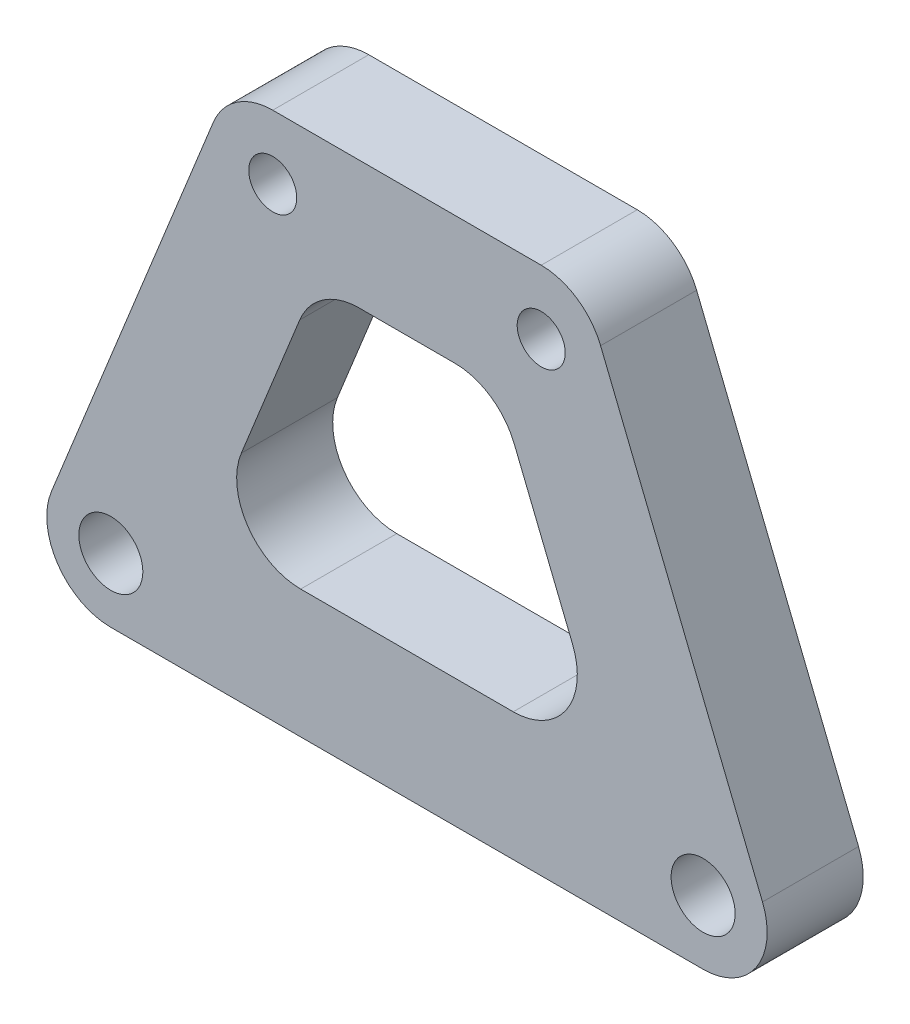
ISO-10303-21;
HEADER;
FILE_DESCRIPTION(('STEP AP214'),'2;1');
FILE_NAME('part.step','',(''),(''),'','','');
FILE_SCHEMA(('AUTOMOTIVE_DESIGN { 1 0 10303 214 1 1 1 1 }'));
ENDSEC;
DATA;
#1=APPLICATION_CONTEXT('core data for automotive mechanical design processes');
#2=APPLICATION_PROTOCOL_DEFINITION('international standard','automotive_design',2000,#1);
#3=PRODUCT_CONTEXT('',#1,'mechanical');
#4=PRODUCT('Part','Part','',(#3));
#5=PRODUCT_RELATED_PRODUCT_CATEGORY('part','',(#4));
#6=PRODUCT_DEFINITION_FORMATION('','',#4);
#7=PRODUCT_DEFINITION_CONTEXT('part definition',#1,'design');
#8=PRODUCT_DEFINITION('design','',#6,#7);
#9=PRODUCT_DEFINITION_SHAPE('','',#8);
#10=(LENGTH_UNIT() NAMED_UNIT(*) SI_UNIT(.MILLI.,.METRE.));
#11=(NAMED_UNIT(*) PLANE_ANGLE_UNIT() SI_UNIT($,.RADIAN.));
#12=(NAMED_UNIT(*) SI_UNIT($,.STERADIAN.) SOLID_ANGLE_UNIT());
#13=UNCERTAINTY_MEASURE_WITH_UNIT(LENGTH_MEASURE(1.E-05),#10,'distance_accuracy_value','');
#14=(GEOMETRIC_REPRESENTATION_CONTEXT(3) GLOBAL_UNCERTAINTY_ASSIGNED_CONTEXT((#13)) GLOBAL_UNIT_ASSIGNED_CONTEXT((#10,
#11,#12)) REPRESENTATION_CONTEXT('',''));
#15=CARTESIAN_POINT('',(0.,0.,0.));
#16=DIRECTION('',(0.,0.,1.));
#17=DIRECTION('',(1.,0.,0.));
#18=AXIS2_PLACEMENT_3D('',#15,#16,#17);
#19=CARTESIAN_POINT('',(0.,4.,6.));
#20=DIRECTION('',(0.,1.,0.));
#21=DIRECTION('',(0.,0.,1.));
#22=AXIS2_PLACEMENT_3D('',#19,#20,#21);
#23=PLANE('',#22);
#24=DIRECTION('',(1.,0.,0.));
#25=VECTOR('',#24,1.);
#26=CARTESIAN_POINT('',(0.,4.,0.));
#27=LINE('',#26,#25);
#28=CARTESIAN_POINT('',(11.8604877481019,4.,0.));
#29=VERTEX_POINT('',#28);
#30=CARTESIAN_POINT('',(25.1395122518981,4.,0.));
#31=VERTEX_POINT('',#30);
#32=EDGE_CURVE('E184',#29,#31,#27,.T.);
#33=ORIENTED_EDGE('',*,*,#32,.F.);
#34=DIRECTION('',(0.,0.,-1.));
#35=VECTOR('',#34,1.);
#36=CARTESIAN_POINT('',(11.8604877481019,4.,6.));
#37=LINE('',#36,#35);
#38=CARTESIAN_POINT('',(11.8604877481019,4.,6.));
#39=VERTEX_POINT('',#38);
#40=EDGE_CURVE('E162',#29,#39,#37,.F.);
#41=ORIENTED_EDGE('',*,*,#40,.T.);
#42=DIRECTION('',(1.,0.,0.));
#43=VECTOR('',#42,1.);
#44=CARTESIAN_POINT('',(0.,4.,6.));
#45=LINE('',#44,#43);
#46=CARTESIAN_POINT('',(25.1395122518981,4.,6.));
#47=VERTEX_POINT('',#46);
#48=EDGE_CURVE('E277',#39,#47,#45,.T.);
#49=ORIENTED_EDGE('',*,*,#48,.T.);
#50=DIRECTION('',(0.,0.,-1.));
#51=VECTOR('',#50,1.);
#52=CARTESIAN_POINT('',(25.1395122518981,4.,6.));
#53=LINE('',#52,#51);
#54=EDGE_CURVE('E178',#47,#31,#53,.T.);
#55=ORIENTED_EDGE('',*,*,#54,.T.);
#56=EDGE_LOOP('',(#33,#41,#49,#55));
#57=FACE_BOUND('',#56,.T.);
#58=ADVANCED_FACE('F43',(#57),#23,.T.);
#59=CARTESIAN_POINT('',(3.70873541826715,-1.49842637366364,6.));
#60=DIRECTION('',(-0.927183854566789,0.37460659341591,0.));
#61=DIRECTION('',(-0.37460659341591,-0.927183854566789,0.));
#62=AXIS2_PLACEMENT_3D('',#59,#60,#61);
#63=PLANE('',#62);
#64=DIRECTION('',(0.37460659341591,0.927183854566788,0.));
#65=VECTOR('',#64,1.);
#66=CARTESIAN_POINT('',(3.70873541826715,-1.49842637366364,6.));
#67=LINE('',#66,#65);
#68=CARTESIAN_POINT('',(8.15175232983473,9.49842637366364,6.));
#69=VERTEX_POINT('',#68);
#70=CARTESIAN_POINT('',(11.8017107387018,18.5323904469669,6.));
#71=VERTEX_POINT('',#70);
#72=EDGE_CURVE('E177',#69,#71,#67,.T.);
#73=ORIENTED_EDGE('',*,*,#72,.F.);
#74=DIRECTION('',(0.,0.,-1.));
#75=VECTOR('',#74,1.);
#76=CARTESIAN_POINT('',(8.15175232983473,9.49842637366364,6.));
#77=LINE('',#76,#75);
#78=CARTESIAN_POINT('',(8.15175232983473,9.49842637366364,0.));
#79=VERTEX_POINT('',#78);
#80=EDGE_CURVE('E161',#69,#79,#77,.T.);
#81=ORIENTED_EDGE('',*,*,#80,.T.);
#82=DIRECTION('',(0.37460659341591,0.927183854566788,0.));
#83=VECTOR('',#82,1.);
#84=CARTESIAN_POINT('',(3.70873541826715,-1.49842637366364,0.));
#85=LINE('',#84,#83);
#86=CARTESIAN_POINT('',(11.8017107387018,18.5323904469669,0.));
#87=VERTEX_POINT('',#86);
#88=EDGE_CURVE('E174',#79,#87,#85,.T.);
#89=ORIENTED_EDGE('',*,*,#88,.T.);
#90=DIRECTION('',(0.,0.,-1.));
#91=VECTOR('',#90,1.);
#92=CARTESIAN_POINT('',(11.8017107387018,18.5323904469669,6.));
#93=LINE('',#92,#91);
#94=EDGE_CURVE('E179',#87,#71,#93,.F.);
#95=ORIENTED_EDGE('',*,*,#94,.T.);
#96=EDGE_LOOP('',(#73,#81,#89,#95));
#97=FACE_BOUND('',#96,.T.);
#98=ADVANCED_FACE('F173',(#97),#63,.F.);
#99=CARTESIAN_POINT('',(0.,21.0339640733033,6.));
#100=DIRECTION('',(0.,1.,0.));
#101=DIRECTION('',(0.,0.,1.));
#102=AXIS2_PLACEMENT_3D('',#99,#100,#101);
#103=PLANE('',#102);
#104=DIRECTION('',(1.,0.,0.));
#105=VECTOR('',#104,1.);
#106=CARTESIAN_POINT('',(0.,21.0339640733033,0.));
#107=LINE('',#106,#105);
#108=CARTESIAN_POINT('',(15.510446156969,21.0339640733033,0.));
#109=VERTEX_POINT('',#108);
#110=CARTESIAN_POINT('',(21.489553843031,21.0339640733033,0.));
#111=VERTEX_POINT('',#110);
#112=EDGE_CURVE('E183',#109,#111,#107,.T.);
#113=ORIENTED_EDGE('',*,*,#112,.T.);
#114=DIRECTION('',(0.,0.,-1.));
#115=VECTOR('',#114,1.);
#116=CARTESIAN_POINT('',(21.489553843031,21.0339640733033,6.));
#117=LINE('',#116,#115);
#118=CARTESIAN_POINT('',(21.489553843031,21.0339640733033,6.));
#119=VERTEX_POINT('',#118);
#120=EDGE_CURVE('E209',#111,#119,#117,.F.);
#121=ORIENTED_EDGE('',*,*,#120,.T.);
#122=DIRECTION('',(1.,0.,0.));
#123=VECTOR('',#122,1.);
#124=CARTESIAN_POINT('',(0.,21.0339640733033,6.));
#125=LINE('',#124,#123);
#126=CARTESIAN_POINT('',(15.510446156969,21.0339640733033,6.));
#127=VERTEX_POINT('',#126);
#128=EDGE_CURVE('E261',#127,#119,#125,.T.);
#129=ORIENTED_EDGE('',*,*,#128,.F.);
#130=DIRECTION('',(0.,0.,-1.));
#131=VECTOR('',#130,1.);
#132=CARTESIAN_POINT('',(15.510446156969,21.0339640733033,0.));
#133=LINE('',#132,#131);
#134=EDGE_CURVE('E206',#127,#109,#133,.T.);
#135=ORIENTED_EDGE('',*,*,#134,.T.);
#136=EDGE_LOOP('',(#113,#121,#129,#135));
#137=FACE_BOUND('',#136,.T.);
#138=ADVANCED_FACE('F272',(#137),#103,.F.);
#139=CARTESIAN_POINT('',(-3.70873541826715,1.49842637366364,6.));
#140=DIRECTION('',(-0.927183854566788,0.374606593415909,0.));
#141=DIRECTION('',(-0.374606593415909,-0.927183854566789,0.));
#142=AXIS2_PLACEMENT_3D('',#139,#140,#141);
#143=PLANE('',#142);
#144=DIRECTION('',(0.374606593415909,0.927183854566789,0.));
#145=VECTOR('',#144,1.);
#146=CARTESIAN_POINT('',(-3.70873541826715,1.49842637366364,0.));
#147=LINE('',#146,#145);
#148=CARTESIAN_POINT('',(-3.70873541826715,1.49842637366364,0.));
#149=VERTEX_POINT('',#148);
#150=CARTESIAN_POINT('',(6.4056426039624,26.5323904469669,0.));
#151=VERTEX_POINT('',#150);
#152=EDGE_CURVE('E285',#149,#151,#147,.T.);
#153=ORIENTED_EDGE('',*,*,#152,.F.);
#154=DIRECTION('',(0.,0.,-1.));
#155=VECTOR('',#154,1.);
#156=CARTESIAN_POINT('',(-3.70873541826715,1.49842637366364,6.));
#157=LINE('',#156,#155);
#158=CARTESIAN_POINT('',(-3.70873541826715,1.49842637366364,6.));
#159=VERTEX_POINT('',#158);
#160=EDGE_CURVE('E227',#149,#159,#157,.F.);
#161=ORIENTED_EDGE('',*,*,#160,.T.);
#162=DIRECTION('',(0.374606593415909,0.927183854566789,0.));
#163=VECTOR('',#162,1.);
#164=CARTESIAN_POINT('',(-3.70873541826715,1.49842637366364,6.));
#165=LINE('',#164,#163);
#166=CARTESIAN_POINT('',(6.4056426039624,26.5323904469669,6.));
#167=VERTEX_POINT('',#166);
#168=EDGE_CURVE('E195',#159,#167,#165,.T.);
#169=ORIENTED_EDGE('',*,*,#168,.T.);
#170=DIRECTION('',(0.,0.,-1.));
#171=VECTOR('',#170,1.);
#172=CARTESIAN_POINT('',(6.4056426039624,26.5323904469669,6.));
#173=LINE('',#172,#171);
#174=EDGE_CURVE('E224',#167,#151,#173,.T.);
#175=ORIENTED_EDGE('',*,*,#174,.T.);
#176=EDGE_LOOP('',(#153,#161,#169,#175));
#177=FACE_BOUND('',#176,.T.);
#178=ADVANCED_FACE('F308',(#177),#143,.T.);
#179=CARTESIAN_POINT('',(0.,-4.,6.));
#180=DIRECTION('',(0.,1.,0.));
#181=DIRECTION('',(0.,0.,1.));
#182=AXIS2_PLACEMENT_3D('',#179,#180,#181);
#183=PLANE('',#182);
#184=DIRECTION('',(1.,0.,0.));
#185=VECTOR('',#184,1.);
#186=CARTESIAN_POINT('',(0.,-4.,6.));
#187=LINE('',#186,#185);
#188=CARTESIAN_POINT('',(0.,-4.,6.));
#189=VERTEX_POINT('',#188);
#190=CARTESIAN_POINT('',(37.,-4.,6.));
#191=VERTEX_POINT('',#190);
#192=EDGE_CURVE('E310',#189,#191,#187,.T.);
#193=ORIENTED_EDGE('',*,*,#192,.F.);
#194=DIRECTION('',(0.,0.,-1.));
#195=VECTOR('',#194,1.);
#196=CARTESIAN_POINT('',(0.,-4.,0.));
#197=LINE('',#196,#195);
#198=CARTESIAN_POINT('',(0.,-4.,0.));
#199=VERTEX_POINT('',#198);
#200=EDGE_CURVE('E213',#189,#199,#197,.T.);
#201=ORIENTED_EDGE('',*,*,#200,.T.);
#202=DIRECTION('',(1.,0.,0.));
#203=VECTOR('',#202,1.);
#204=CARTESIAN_POINT('',(0.,-4.,0.));
#205=LINE('',#204,#203);
#206=CARTESIAN_POINT('',(37.,-4.,0.));
#207=VERTEX_POINT('',#206);
#208=EDGE_CURVE('E288',#199,#207,#205,.T.);
#209=ORIENTED_EDGE('',*,*,#208,.T.);
#210=DIRECTION('',(0.,0.,-1.));
#211=VECTOR('',#210,1.);
#212=CARTESIAN_POINT('',(37.,-4.,6.));
#213=LINE('',#212,#211);
#214=EDGE_CURVE('E211',#207,#191,#213,.F.);
#215=ORIENTED_EDGE('',*,*,#214,.T.);
#216=EDGE_LOOP('',(#193,#201,#209,#215));
#217=FACE_BOUND('',#216,.T.);
#218=ADVANCED_FACE('F332',(#217),#183,.F.);
#219=CARTESIAN_POINT('',(35.5165217245323,14.349606227155,6.));
#220=DIRECTION('',(0.927183854566789,0.37460659341591,0.));
#221=DIRECTION('',(-0.37460659341591,0.927183854566789,0.));
#222=AXIS2_PLACEMENT_3D('',#219,#220,#221);
#223=PLANE('',#222);
#224=DIRECTION('',(0.37460659341591,-0.927183854566788,0.));
#225=VECTOR('',#224,1.);
#226=CARTESIAN_POINT('',(35.5165217245323,14.349606227155,6.));
#227=LINE('',#226,#225);
#228=CARTESIAN_POINT('',(30.5943573960376,26.5323904469669,6.));
#229=VERTEX_POINT('',#228);
#230=CARTESIAN_POINT('',(40.7087354182672,1.49842637366364,6.));
#231=VERTEX_POINT('',#230);
#232=EDGE_CURVE('E313',#229,#231,#227,.T.);
#233=ORIENTED_EDGE('',*,*,#232,.T.);
#234=DIRECTION('',(0.,0.,-1.));
#235=VECTOR('',#234,1.);
#236=CARTESIAN_POINT('',(40.7087354182672,1.49842637366364,0.));
#237=LINE('',#236,#235);
#238=CARTESIAN_POINT('',(40.7087354182672,1.49842637366364,0.));
#239=VERTEX_POINT('',#238);
#240=EDGE_CURVE('E238',#231,#239,#237,.T.);
#241=ORIENTED_EDGE('',*,*,#240,.T.);
#242=DIRECTION('',(0.37460659341591,-0.927183854566788,0.));
#243=VECTOR('',#242,1.);
#244=CARTESIAN_POINT('',(35.5165217245323,14.349606227155,0.));
#245=LINE('',#244,#243);
#246=CARTESIAN_POINT('',(30.5943573960376,26.5323904469669,0.));
#247=VERTEX_POINT('',#246);
#248=EDGE_CURVE('E292',#247,#239,#245,.T.);
#249=ORIENTED_EDGE('',*,*,#248,.F.);
#250=DIRECTION('',(0.,0.,-1.));
#251=VECTOR('',#250,1.);
#252=CARTESIAN_POINT('',(30.5943573960376,26.5323904469669,6.));
#253=LINE('',#252,#251);
#254=EDGE_CURVE('E236',#247,#229,#253,.F.);
#255=ORIENTED_EDGE('',*,*,#254,.T.);
#256=EDGE_LOOP('',(#233,#241,#249,#255));
#257=FACE_BOUND('',#256,.T.);
#258=ADVANCED_FACE('F324',(#257),#223,.T.);
#259=CARTESIAN_POINT('',(0.,29.0339640733033,6.));
#260=DIRECTION('',(0.,1.,0.));
#261=DIRECTION('',(0.,0.,1.));
#262=AXIS2_PLACEMENT_3D('',#259,#260,#261);
#263=PLANE('',#262);
#264=DIRECTION('',(1.,0.,0.));
#265=VECTOR('',#264,1.);
#266=CARTESIAN_POINT('',(0.,29.0339640733033,6.));
#267=LINE('',#266,#265);
#268=CARTESIAN_POINT('',(10.1143780222296,29.0339640733033,6.));
#269=VERTEX_POINT('',#268);
#270=CARTESIAN_POINT('',(26.8856219777704,29.0339640733033,6.));
#271=VERTEX_POINT('',#270);
#272=EDGE_CURVE('E281',#269,#271,#267,.T.);
#273=ORIENTED_EDGE('',*,*,#272,.T.);
#274=DIRECTION('',(0.,0.,-1.));
#275=VECTOR('',#274,1.);
#276=CARTESIAN_POINT('',(26.8856219777704,29.0339640733033,6.));
#277=LINE('',#276,#275);
#278=CARTESIAN_POINT('',(26.8856219777704,29.0339640733033,0.));
#279=VERTEX_POINT('',#278);
#280=EDGE_CURVE('E168',#271,#279,#277,.T.);
#281=ORIENTED_EDGE('',*,*,#280,.T.);
#282=DIRECTION('',(1.,0.,0.));
#283=VECTOR('',#282,1.);
#284=CARTESIAN_POINT('',(0.,29.0339640733033,0.));
#285=LINE('',#284,#283);
#286=CARTESIAN_POINT('',(10.1143780222296,29.0339640733033,0.));
#287=VERTEX_POINT('',#286);
#288=EDGE_CURVE('E189',#287,#279,#285,.T.);
#289=ORIENTED_EDGE('',*,*,#288,.F.);
#290=DIRECTION('',(0.,0.,-1.));
#291=VECTOR('',#290,1.);
#292=CARTESIAN_POINT('',(10.1143780222296,29.0339640733033,6.));
#293=LINE('',#292,#291);
#294=EDGE_CURVE('E65',#287,#269,#293,.F.);
#295=ORIENTED_EDGE('',*,*,#294,.T.);
#296=EDGE_LOOP('',(#273,#281,#289,#295));
#297=FACE_BOUND('',#296,.T.);
#298=ADVANCED_FACE('F298',(#297),#263,.T.);
#299=CARTESIAN_POINT('',(28.099050887998,11.3527534798277,6.));
#300=DIRECTION('',(0.927183854566789,0.374606593415909,0.));
#301=DIRECTION('',(-0.374606593415909,0.927183854566789,0.));
#302=AXIS2_PLACEMENT_3D('',#299,#300,#301);
#303=PLANE('',#302);
#304=DIRECTION('',(0.374606593415909,-0.927183854566789,0.));
#305=VECTOR('',#304,1.);
#306=CARTESIAN_POINT('',(28.099050887998,11.3527534798277,0.));
#307=LINE('',#306,#305);
#308=CARTESIAN_POINT('',(25.1982892612982,18.5323904469669,0.));
#309=VERTEX_POINT('',#308);
#310=CARTESIAN_POINT('',(28.8482476701653,9.49842637366364,0.));
#311=VERTEX_POINT('',#310);
#312=EDGE_CURVE('E187',#309,#311,#307,.T.);
#313=ORIENTED_EDGE('',*,*,#312,.T.);
#314=DIRECTION('',(0.,0.,-1.));
#315=VECTOR('',#314,1.);
#316=CARTESIAN_POINT('',(28.8482476701653,9.49842637366364,6.));
#317=LINE('',#316,#315);
#318=CARTESIAN_POINT('',(28.8482476701653,9.49842637366364,6.));
#319=VERTEX_POINT('',#318);
#320=EDGE_CURVE('E204',#311,#319,#317,.F.);
#321=ORIENTED_EDGE('',*,*,#320,.T.);
#322=DIRECTION('',(0.374606593415909,-0.927183854566789,0.));
#323=VECTOR('',#322,1.);
#324=CARTESIAN_POINT('',(28.099050887998,11.3527534798277,6.));
#325=LINE('',#324,#323);
#326=CARTESIAN_POINT('',(25.1982892612982,18.5323904469669,6.));
#327=VERTEX_POINT('',#326);
#328=EDGE_CURVE('E196',#327,#319,#325,.T.);
#329=ORIENTED_EDGE('',*,*,#328,.F.);
#330=DIRECTION('',(0.,0.,-1.));
#331=VECTOR('',#330,1.);
#332=CARTESIAN_POINT('',(25.1982892612982,18.5323904469669,0.));
#333=LINE('',#332,#331);
#334=EDGE_CURVE('E201',#327,#309,#333,.T.);
#335=ORIENTED_EDGE('',*,*,#334,.T.);
#336=EDGE_LOOP('',(#313,#321,#329,#335));
#337=FACE_BOUND('',#336,.T.);
#338=ADVANCED_FACE('F266',(#337),#303,.F.);
#339=CARTESIAN_POINT('',(0.,0.,6.));
#340=DIRECTION('',(0.,0.,1.));
#341=DIRECTION('',(1.,0.,0.));
#342=AXIS2_PLACEMENT_3D('',#339,#340,#341);
#343=PLANE('',#342);
#344=CARTESIAN_POINT('',(0.,0.,6.));
#345=DIRECTION('',(0.,0.,1.));
#346=DIRECTION('',(1.,0.,0.));
#347=AXIS2_PLACEMENT_3D('',#344,#345,#346);
#348=CIRCLE('',#347,2.);
#349=CARTESIAN_POINT('',(2.,0.,6.));
#350=VERTEX_POINT('',#349);
#351=EDGE_CURVE('E528',#350,#350,#348,.T.);
#352=ORIENTED_EDGE('',*,*,#351,.F.);
#353=EDGE_LOOP('',(#352));
#354=FACE_BOUND('',#353,.T.);
#355=CARTESIAN_POINT('',(37.,0.,6.));
#356=DIRECTION('',(0.,0.,1.));
#357=DIRECTION('',(1.,0.,0.));
#358=AXIS2_PLACEMENT_3D('',#355,#356,#357);
#359=CIRCLE('',#358,2.);
#360=CARTESIAN_POINT('',(39.,0.,6.));
#361=VERTEX_POINT('',#360);
#362=EDGE_CURVE('E532',#361,#361,#359,.T.);
#363=ORIENTED_EDGE('',*,*,#362,.F.);
#364=EDGE_LOOP('',(#363));
#365=FACE_BOUND('',#364,.T.);
#366=CARTESIAN_POINT('',(26.8856219777705,25.0339640733033,6.));
#367=DIRECTION('',(0.,0.,1.));
#368=DIRECTION('',(1.,0.,0.));
#369=AXIS2_PLACEMENT_3D('',#366,#367,#368);
#370=CIRCLE('',#369,1.5);
#371=CARTESIAN_POINT('',(28.3856219777705,25.0339640733033,6.));
#372=VERTEX_POINT('',#371);
#373=EDGE_CURVE('E536',#372,#372,#370,.T.);
#374=ORIENTED_EDGE('',*,*,#373,.F.);
#375=EDGE_LOOP('',(#374));
#376=FACE_BOUND('',#375,.T.);
#377=CARTESIAN_POINT('',(10.1143780222296,25.0339640733033,6.));
#378=DIRECTION('',(0.,0.,1.));
#379=DIRECTION('',(1.,0.,0.));
#380=AXIS2_PLACEMENT_3D('',#377,#378,#379);
#381=CIRCLE('',#380,1.5);
#382=CARTESIAN_POINT('',(11.6143780222296,25.0339640733033,6.));
#383=VERTEX_POINT('',#382);
#384=EDGE_CURVE('E539',#383,#383,#381,.T.);
#385=ORIENTED_EDGE('',*,*,#384,.F.);
#386=EDGE_LOOP('',(#385));
#387=FACE_BOUND('',#386,.T.);
#388=ORIENTED_EDGE('',*,*,#168,.F.);
#389=CARTESIAN_POINT('',(0.,0.,6.));
#390=DIRECTION('',(0.,0.,1.));
#391=DIRECTION('',(1.,0.,0.));
#392=AXIS2_PLACEMENT_3D('',#389,#390,#391);
#393=CIRCLE('',#392,4.);
#394=EDGE_CURVE('E234',#159,#189,#393,.T.);
#395=ORIENTED_EDGE('',*,*,#394,.T.);
#396=ORIENTED_EDGE('',*,*,#192,.T.);
#397=CARTESIAN_POINT('',(37.,0.,6.));
#398=DIRECTION('',(0.,0.,1.));
#399=DIRECTION('',(1.,0.,0.));
#400=AXIS2_PLACEMENT_3D('',#397,#398,#399);
#401=CIRCLE('',#400,4.);
#402=EDGE_CURVE('E232',#191,#231,#401,.T.);
#403=ORIENTED_EDGE('',*,*,#402,.T.);
#404=ORIENTED_EDGE('',*,*,#232,.F.);
#405=CARTESIAN_POINT('',(26.8856219777704,25.0339640733033,6.));
#406=DIRECTION('',(0.,0.,1.));
#407=DIRECTION('',(1.,0.,0.));
#408=AXIS2_PLACEMENT_3D('',#405,#406,#407);
#409=CIRCLE('',#408,4.);
#410=EDGE_CURVE('E58',#229,#271,#409,.T.);
#411=ORIENTED_EDGE('',*,*,#410,.T.);
#412=ORIENTED_EDGE('',*,*,#272,.F.);
#413=CARTESIAN_POINT('',(10.1143780222296,25.0339640733033,6.));
#414=DIRECTION('',(0.,0.,1.));
#415=DIRECTION('',(1.,0.,0.));
#416=AXIS2_PLACEMENT_3D('',#413,#414,#415);
#417=CIRCLE('',#416,4.);
#418=EDGE_CURVE('E229',#269,#167,#417,.T.);
#419=ORIENTED_EDGE('',*,*,#418,.T.);
#420=EDGE_LOOP('',(#388,#395,#396,#403,#404,#411,#412,#419));
#421=FACE_BOUND('',#420,.T.);
#422=ORIENTED_EDGE('',*,*,#48,.F.);
#423=CARTESIAN_POINT('',(11.8604877481019,8.,6.));
#424=DIRECTION('',(0.,0.,1.));
#425=DIRECTION('',(1.,0.,0.));
#426=AXIS2_PLACEMENT_3D('',#423,#424,#425);
#427=CIRCLE('',#426,4.);
#428=EDGE_CURVE('E167',#39,#69,#427,.F.);
#429=ORIENTED_EDGE('',*,*,#428,.T.);
#430=ORIENTED_EDGE('',*,*,#72,.T.);
#431=CARTESIAN_POINT('',(15.510446156969,17.0339640733033,6.));
#432=DIRECTION('',(0.,0.,1.));
#433=DIRECTION('',(1.,0.,0.));
#434=AXIS2_PLACEMENT_3D('',#431,#432,#433);
#435=CIRCLE('',#434,4.);
#436=EDGE_CURVE('E11',#71,#127,#435,.F.);
#437=ORIENTED_EDGE('',*,*,#436,.T.);
#438=ORIENTED_EDGE('',*,*,#128,.T.);
#439=CARTESIAN_POINT('',(21.489553843031,17.0339640733033,6.));
#440=DIRECTION('',(0.,0.,1.));
#441=DIRECTION('',(1.,0.,0.));
#442=AXIS2_PLACEMENT_3D('',#439,#440,#441);
#443=CIRCLE('',#442,4.);
#444=EDGE_CURVE('E251',#119,#327,#443,.F.);
#445=ORIENTED_EDGE('',*,*,#444,.T.);
#446=ORIENTED_EDGE('',*,*,#328,.T.);
#447=CARTESIAN_POINT('',(25.1395122518981,8.,6.));
#448=DIRECTION('',(0.,0.,1.));
#449=DIRECTION('',(1.,0.,0.));
#450=AXIS2_PLACEMENT_3D('',#447,#448,#449);
#451=CIRCLE('',#450,4.);
#452=EDGE_CURVE('E247',#319,#47,#451,.F.);
#453=ORIENTED_EDGE('',*,*,#452,.T.);
#454=EDGE_LOOP('',(#422,#429,#430,#437,#438,#445,#446,#453));
#455=FACE_BOUND('',#454,.T.);
#456=ADVANCED_FACE('F258',(#354,#365,#376,#387,#421,#455),#343,.T.);
#457=CARTESIAN_POINT('',(0.,0.,0.));
#458=DIRECTION('',(0.,0.,1.));
#459=DIRECTION('',(1.,0.,0.));
#460=AXIS2_PLACEMENT_3D('',#457,#458,#459);
#461=PLANE('',#460);
#462=CARTESIAN_POINT('',(0.,0.,0.));
#463=DIRECTION('',(0.,0.,1.));
#464=DIRECTION('',(1.,0.,0.));
#465=AXIS2_PLACEMENT_3D('',#462,#463,#464);
#466=CIRCLE('',#465,2.);
#467=CARTESIAN_POINT('',(2.,0.,0.));
#468=VERTEX_POINT('',#467);
#469=EDGE_CURVE('E289',#468,#468,#466,.T.);
#470=ORIENTED_EDGE('',*,*,#469,.T.);
#471=EDGE_LOOP('',(#470));
#472=FACE_BOUND('',#471,.T.);
#473=CARTESIAN_POINT('',(37.,0.,0.));
#474=DIRECTION('',(0.,0.,1.));
#475=DIRECTION('',(1.,0.,0.));
#476=AXIS2_PLACEMENT_3D('',#473,#474,#475);
#477=CIRCLE('',#476,2.);
#478=CARTESIAN_POINT('',(39.,0.,0.));
#479=VERTEX_POINT('',#478);
#480=EDGE_CURVE('E547',#479,#479,#477,.T.);
#481=ORIENTED_EDGE('',*,*,#480,.T.);
#482=EDGE_LOOP('',(#481));
#483=FACE_BOUND('',#482,.T.);
#484=CARTESIAN_POINT('',(26.8856219777705,25.0339640733033,0.));
#485=DIRECTION('',(0.,0.,1.));
#486=DIRECTION('',(1.,0.,0.));
#487=AXIS2_PLACEMENT_3D('',#484,#485,#486);
#488=CIRCLE('',#487,1.5);
#489=CARTESIAN_POINT('',(28.3856219777705,25.0339640733033,0.));
#490=VERTEX_POINT('',#489);
#491=EDGE_CURVE('E541',#490,#490,#488,.T.);
#492=ORIENTED_EDGE('',*,*,#491,.T.);
#493=EDGE_LOOP('',(#492));
#494=FACE_BOUND('',#493,.T.);
#495=CARTESIAN_POINT('',(10.1143780222296,25.0339640733033,0.));
#496=DIRECTION('',(0.,0.,1.));
#497=DIRECTION('',(1.,0.,0.));
#498=AXIS2_PLACEMENT_3D('',#495,#496,#497);
#499=CIRCLE('',#498,1.5);
#500=CARTESIAN_POINT('',(11.6143780222296,25.0339640733033,0.));
#501=VERTEX_POINT('',#500);
#502=EDGE_CURVE('E316',#501,#501,#499,.T.);
#503=ORIENTED_EDGE('',*,*,#502,.T.);
#504=EDGE_LOOP('',(#503));
#505=FACE_BOUND('',#504,.T.);
#506=ORIENTED_EDGE('',*,*,#208,.F.);
#507=CARTESIAN_POINT('',(0.,0.,0.));
#508=DIRECTION('',(0.,0.,1.));
#509=DIRECTION('',(1.,0.,0.));
#510=AXIS2_PLACEMENT_3D('',#507,#508,#509);
#511=CIRCLE('',#510,4.);
#512=EDGE_CURVE('E222',#199,#149,#511,.F.);
#513=ORIENTED_EDGE('',*,*,#512,.T.);
#514=ORIENTED_EDGE('',*,*,#152,.T.);
#515=CARTESIAN_POINT('',(10.1143780222296,25.0339640733033,0.));
#516=DIRECTION('',(0.,0.,1.));
#517=DIRECTION('',(1.,0.,0.));
#518=AXIS2_PLACEMENT_3D('',#515,#516,#517);
#519=CIRCLE('',#518,4.);
#520=EDGE_CURVE('E216',#151,#287,#519,.F.);
#521=ORIENTED_EDGE('',*,*,#520,.T.);
#522=ORIENTED_EDGE('',*,*,#288,.T.);
#523=CARTESIAN_POINT('',(26.8856219777704,25.0339640733033,0.));
#524=DIRECTION('',(0.,0.,1.));
#525=DIRECTION('',(1.,0.,0.));
#526=AXIS2_PLACEMENT_3D('',#523,#524,#525);
#527=CIRCLE('',#526,4.);
#528=EDGE_CURVE('E218',#279,#247,#527,.F.);
#529=ORIENTED_EDGE('',*,*,#528,.T.);
#530=ORIENTED_EDGE('',*,*,#248,.T.);
#531=CARTESIAN_POINT('',(37.,0.,0.));
#532=DIRECTION('',(0.,0.,1.));
#533=DIRECTION('',(1.,0.,0.));
#534=AXIS2_PLACEMENT_3D('',#531,#532,#533);
#535=CIRCLE('',#534,4.);
#536=EDGE_CURVE('E220',#239,#207,#535,.F.);
#537=ORIENTED_EDGE('',*,*,#536,.T.);
#538=EDGE_LOOP('',(#506,#513,#514,#521,#522,#529,#530,#537));
#539=FACE_BOUND('',#538,.T.);
#540=ORIENTED_EDGE('',*,*,#88,.F.);
#541=CARTESIAN_POINT('',(11.8604877481019,8.,0.));
#542=DIRECTION('',(0.,0.,1.));
#543=DIRECTION('',(1.,0.,0.));
#544=AXIS2_PLACEMENT_3D('',#541,#542,#543);
#545=CIRCLE('',#544,4.);
#546=EDGE_CURVE('E157',#79,#29,#545,.T.);
#547=ORIENTED_EDGE('',*,*,#546,.T.);
#548=ORIENTED_EDGE('',*,*,#32,.T.);
#549=CARTESIAN_POINT('',(25.1395122518981,8.,0.));
#550=DIRECTION('',(0.,0.,1.));
#551=DIRECTION('',(1.,0.,0.));
#552=AXIS2_PLACEMENT_3D('',#549,#550,#551);
#553=CIRCLE('',#552,4.);
#554=EDGE_CURVE('E245',#31,#311,#553,.T.);
#555=ORIENTED_EDGE('',*,*,#554,.T.);
#556=ORIENTED_EDGE('',*,*,#312,.F.);
#557=CARTESIAN_POINT('',(21.489553843031,17.0339640733033,0.));
#558=DIRECTION('',(0.,0.,1.));
#559=DIRECTION('',(1.,0.,0.));
#560=AXIS2_PLACEMENT_3D('',#557,#558,#559);
#561=CIRCLE('',#560,4.);
#562=EDGE_CURVE('E249',#309,#111,#561,.T.);
#563=ORIENTED_EDGE('',*,*,#562,.T.);
#564=ORIENTED_EDGE('',*,*,#112,.F.);
#565=CARTESIAN_POINT('',(15.510446156969,17.0339640733033,0.));
#566=DIRECTION('',(0.,0.,1.));
#567=DIRECTION('',(1.,0.,0.));
#568=AXIS2_PLACEMENT_3D('',#565,#566,#567);
#569=CIRCLE('',#568,4.);
#570=EDGE_CURVE('E51',#109,#87,#569,.T.);
#571=ORIENTED_EDGE('',*,*,#570,.T.);
#572=EDGE_LOOP('',(#540,#547,#548,#555,#556,#563,#564,#571));
#573=FACE_BOUND('',#572,.T.);
#574=ADVANCED_FACE('F181',(#472,#483,#494,#505,#539,#573),#461,.F.);
#575=CARTESIAN_POINT('',(10.1143780222296,25.0339640733033,0.));
#576=DIRECTION('',(0.,0.,1.));
#577=DIRECTION('',(1.,0.,0.));
#578=AXIS2_PLACEMENT_3D('',#575,#576,#577);
#579=CYLINDRICAL_SURFACE('',#578,1.5);
#580=ORIENTED_EDGE('',*,*,#502,.F.);
#581=EDGE_LOOP('',(#580));
#582=FACE_BOUND('',#581,.T.);
#583=ORIENTED_EDGE('',*,*,#384,.T.);
#584=EDGE_LOOP('',(#583));
#585=FACE_BOUND('',#584,.T.);
#586=ADVANCED_FACE('F439',(#582,#585),#579,.F.);
#587=CARTESIAN_POINT('',(26.8856219777705,25.0339640733033,0.));
#588=DIRECTION('',(0.,0.,1.));
#589=DIRECTION('',(1.,0.,0.));
#590=AXIS2_PLACEMENT_3D('',#587,#588,#589);
#591=CYLINDRICAL_SURFACE('',#590,1.5);
#592=ORIENTED_EDGE('',*,*,#491,.F.);
#593=EDGE_LOOP('',(#592));
#594=FACE_BOUND('',#593,.T.);
#595=ORIENTED_EDGE('',*,*,#373,.T.);
#596=EDGE_LOOP('',(#595));
#597=FACE_BOUND('',#596,.T.);
#598=ADVANCED_FACE('F430',(#594,#597),#591,.F.);
#599=CARTESIAN_POINT('',(37.,0.,0.));
#600=DIRECTION('',(0.,0.,1.));
#601=DIRECTION('',(1.,0.,0.));
#602=AXIS2_PLACEMENT_3D('',#599,#600,#601);
#603=CYLINDRICAL_SURFACE('',#602,2.);
#604=ORIENTED_EDGE('',*,*,#480,.F.);
#605=EDGE_LOOP('',(#604));
#606=FACE_BOUND('',#605,.T.);
#607=ORIENTED_EDGE('',*,*,#362,.T.);
#608=EDGE_LOOP('',(#607));
#609=FACE_BOUND('',#608,.T.);
#610=ADVANCED_FACE('F421',(#606,#609),#603,.F.);
#611=CARTESIAN_POINT('',(0.,0.,0.));
#612=DIRECTION('',(0.,0.,1.));
#613=DIRECTION('',(1.,0.,0.));
#614=AXIS2_PLACEMENT_3D('',#611,#612,#613);
#615=CYLINDRICAL_SURFACE('',#614,2.);
#616=ORIENTED_EDGE('',*,*,#469,.F.);
#617=EDGE_LOOP('',(#616));
#618=FACE_BOUND('',#617,.T.);
#619=ORIENTED_EDGE('',*,*,#351,.T.);
#620=EDGE_LOOP('',(#619));
#621=FACE_BOUND('',#620,.T.);
#622=ADVANCED_FACE('F365',(#618,#621),#615,.F.);
#623=CARTESIAN_POINT('',(11.8604877481019,8.,6.));
#624=DIRECTION('',(0.,0.,-1.));
#625=DIRECTION('',(-1.,0.,0.));
#626=AXIS2_PLACEMENT_3D('',#623,#624,#625);
#627=CYLINDRICAL_SURFACE('',#626,4.);
#628=ORIENTED_EDGE('',*,*,#428,.F.);
#629=ORIENTED_EDGE('',*,*,#40,.F.);
#630=ORIENTED_EDGE('',*,*,#546,.F.);
#631=ORIENTED_EDGE('',*,*,#80,.F.);
#632=EDGE_LOOP('',(#628,#629,#630,#631));
#633=FACE_BOUND('',#632,.T.);
#634=ADVANCED_FACE('F160',(#633),#627,.F.);
#635=CARTESIAN_POINT('',(25.1395122518981,8.,6.));
#636=DIRECTION('',(0.,0.,-1.));
#637=DIRECTION('',(-1.,0.,0.));
#638=AXIS2_PLACEMENT_3D('',#635,#636,#637);
#639=CYLINDRICAL_SURFACE('',#638,4.);
#640=ORIENTED_EDGE('',*,*,#452,.F.);
#641=ORIENTED_EDGE('',*,*,#320,.F.);
#642=ORIENTED_EDGE('',*,*,#554,.F.);
#643=ORIENTED_EDGE('',*,*,#54,.F.);
#644=EDGE_LOOP('',(#640,#641,#642,#643));
#645=FACE_BOUND('',#644,.T.);
#646=ADVANCED_FACE('F364',(#645),#639,.F.);
#647=CARTESIAN_POINT('',(21.489553843031,17.0339640733033,6.));
#648=DIRECTION('',(0.,0.,1.));
#649=DIRECTION('',(1.,0.,0.));
#650=AXIS2_PLACEMENT_3D('',#647,#648,#649);
#651=CYLINDRICAL_SURFACE('',#650,4.);
#652=ORIENTED_EDGE('',*,*,#444,.F.);
#653=ORIENTED_EDGE('',*,*,#120,.F.);
#654=ORIENTED_EDGE('',*,*,#562,.F.);
#655=ORIENTED_EDGE('',*,*,#334,.F.);
#656=EDGE_LOOP('',(#652,#653,#654,#655));
#657=FACE_BOUND('',#656,.T.);
#658=ADVANCED_FACE('F270',(#657),#651,.F.);
#659=CARTESIAN_POINT('',(15.510446156969,17.0339640733033,6.));
#660=DIRECTION('',(0.,0.,1.));
#661=DIRECTION('',(1.,0.,0.));
#662=AXIS2_PLACEMENT_3D('',#659,#660,#661);
#663=CYLINDRICAL_SURFACE('',#662,4.);
#664=ORIENTED_EDGE('',*,*,#436,.F.);
#665=ORIENTED_EDGE('',*,*,#94,.F.);
#666=ORIENTED_EDGE('',*,*,#570,.F.);
#667=ORIENTED_EDGE('',*,*,#134,.F.);
#668=EDGE_LOOP('',(#664,#665,#666,#667));
#669=FACE_BOUND('',#668,.T.);
#670=ADVANCED_FACE('F276',(#669),#663,.F.);
#671=CARTESIAN_POINT('',(0.,0.,6.));
#672=DIRECTION('',(0.,0.,1.));
#673=DIRECTION('',(1.,0.,0.));
#674=AXIS2_PLACEMENT_3D('',#671,#672,#673);
#675=CYLINDRICAL_SURFACE('',#674,4.);
#676=ORIENTED_EDGE('',*,*,#394,.F.);
#677=ORIENTED_EDGE('',*,*,#160,.F.);
#678=ORIENTED_EDGE('',*,*,#512,.F.);
#679=ORIENTED_EDGE('',*,*,#200,.F.);
#680=EDGE_LOOP('',(#676,#677,#678,#679));
#681=FACE_BOUND('',#680,.T.);
#682=ADVANCED_FACE('F335',(#681),#675,.T.);
#683=CARTESIAN_POINT('',(37.,0.,6.));
#684=DIRECTION('',(0.,0.,1.));
#685=DIRECTION('',(1.,0.,0.));
#686=AXIS2_PLACEMENT_3D('',#683,#684,#685);
#687=CYLINDRICAL_SURFACE('',#686,4.);
#688=ORIENTED_EDGE('',*,*,#402,.F.);
#689=ORIENTED_EDGE('',*,*,#214,.F.);
#690=ORIENTED_EDGE('',*,*,#536,.F.);
#691=ORIENTED_EDGE('',*,*,#240,.F.);
#692=EDGE_LOOP('',(#688,#689,#690,#691));
#693=FACE_BOUND('',#692,.T.);
#694=ADVANCED_FACE('F330',(#693),#687,.T.);
#695=CARTESIAN_POINT('',(26.8856219777704,25.0339640733033,6.));
#696=DIRECTION('',(0.,0.,-1.));
#697=DIRECTION('',(-1.,0.,0.));
#698=AXIS2_PLACEMENT_3D('',#695,#696,#697);
#699=CYLINDRICAL_SURFACE('',#698,4.);
#700=ORIENTED_EDGE('',*,*,#410,.F.);
#701=ORIENTED_EDGE('',*,*,#254,.F.);
#702=ORIENTED_EDGE('',*,*,#528,.F.);
#703=ORIENTED_EDGE('',*,*,#280,.F.);
#704=EDGE_LOOP('',(#700,#701,#702,#703));
#705=FACE_BOUND('',#704,.T.);
#706=ADVANCED_FACE('F321',(#705),#699,.T.);
#707=CARTESIAN_POINT('',(10.1143780222296,25.0339640733033,6.));
#708=DIRECTION('',(0.,0.,-1.));
#709=DIRECTION('',(-1.,0.,0.));
#710=AXIS2_PLACEMENT_3D('',#707,#708,#709);
#711=CYLINDRICAL_SURFACE('',#710,4.);
#712=ORIENTED_EDGE('',*,*,#418,.F.);
#713=ORIENTED_EDGE('',*,*,#294,.F.);
#714=ORIENTED_EDGE('',*,*,#520,.F.);
#715=ORIENTED_EDGE('',*,*,#174,.F.);
#716=EDGE_LOOP('',(#712,#713,#714,#715));
#717=FACE_BOUND('',#716,.T.);
#718=ADVANCED_FACE('F45',(#717),#711,.T.);
#719=CLOSED_SHELL('',(#58,#98,#138,#178,#218,#258,#298,#338,#456,#574,#586,#598,#610,#622,#634,
#646,#658,#670,#682,#694,#706,#718));
#720=MANIFOLD_SOLID_BREP('B2',#719);
#721=ADVANCED_BREP_SHAPE_REPRESENTATION('',(#18,#720),#14);
#722=SHAPE_DEFINITION_REPRESENTATION(#9,#721);
ENDSEC;
END-ISO-10303-21;
